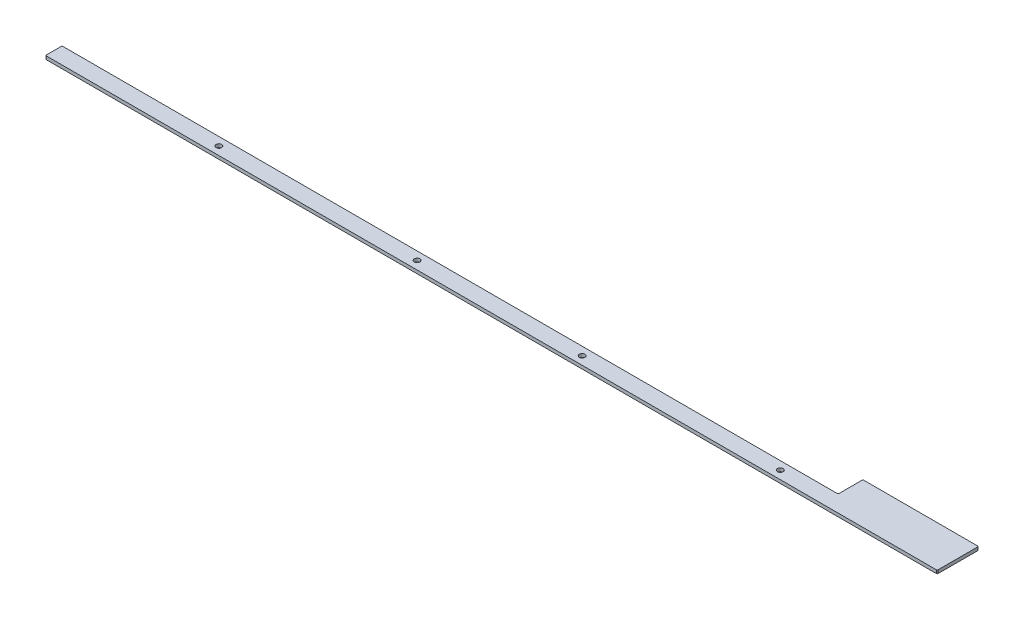
ISO-10303-21;
HEADER;
FILE_DESCRIPTION(('STEP AP214'),'2;1');
FILE_NAME('part.step','',(''),(''),'','','');
FILE_SCHEMA(('AUTOMOTIVE_DESIGN { 1 0 10303 214 1 1 1 1 }'));
ENDSEC;
DATA;
#1=APPLICATION_CONTEXT('core data for automotive mechanical design processes');
#2=APPLICATION_PROTOCOL_DEFINITION('international standard','automotive_design',2000,#1);
#3=PRODUCT_CONTEXT('',#1,'mechanical');
#4=PRODUCT('Part','Part','',(#3));
#5=PRODUCT_RELATED_PRODUCT_CATEGORY('part','',(#4));
#6=PRODUCT_DEFINITION_FORMATION('','',#4);
#7=PRODUCT_DEFINITION_CONTEXT('part definition',#1,'design');
#8=PRODUCT_DEFINITION('design','',#6,#7);
#9=PRODUCT_DEFINITION_SHAPE('','',#8);
#10=(LENGTH_UNIT() NAMED_UNIT(*) SI_UNIT(.MILLI.,.METRE.));
#11=(NAMED_UNIT(*) PLANE_ANGLE_UNIT() SI_UNIT($,.RADIAN.));
#12=(NAMED_UNIT(*) SI_UNIT($,.STERADIAN.) SOLID_ANGLE_UNIT());
#13=UNCERTAINTY_MEASURE_WITH_UNIT(LENGTH_MEASURE(1.E-05),#10,'distance_accuracy_value','');
#14=(GEOMETRIC_REPRESENTATION_CONTEXT(3) GLOBAL_UNCERTAINTY_ASSIGNED_CONTEXT((#13)) GLOBAL_UNIT_ASSIGNED_CONTEXT((#10,
#11,#12)) REPRESENTATION_CONTEXT('',''));
#15=CARTESIAN_POINT('',(0.,0.,0.));
#16=DIRECTION('',(0.,0.,1.));
#17=DIRECTION('',(1.,0.,0.));
#18=AXIS2_PLACEMENT_3D('',#15,#16,#17);
#19=CARTESIAN_POINT('',(-270.,2.,-5.00000000000003));
#20=DIRECTION('',(1.,0.,0.));
#21=DIRECTION('',(0.,0.,1.));
#22=AXIS2_PLACEMENT_3D('',#19,#20,#21);
#23=PLANE('',#22);
#24=DIRECTION('',(0.,0.,-1.));
#25=VECTOR('',#24,1.);
#26=CARTESIAN_POINT('',(-270.,0.,-5.00000000000003));
#27=LINE('',#26,#25);
#28=CARTESIAN_POINT('',(-270.,0.,4.49999999999997));
#29=VERTEX_POINT('',#28);
#30=CARTESIAN_POINT('',(-270.,0.,-4.50000000000004));
#31=VERTEX_POINT('',#30);
#32=EDGE_CURVE('E136',#29,#31,#27,.T.);
#33=ORIENTED_EDGE('',*,*,#32,.F.);
#34=DIRECTION('',(0.,-1.,0.));
#35=VECTOR('',#34,1.);
#36=CARTESIAN_POINT('',(-270.,2.,4.49999999999997));
#37=LINE('',#36,#35);
#38=CARTESIAN_POINT('',(-270.,2.,4.49999999999997));
#39=VERTEX_POINT('',#38);
#40=EDGE_CURVE('E140',#39,#29,#37,.T.);
#41=ORIENTED_EDGE('',*,*,#40,.F.);
#42=DIRECTION('',(0.,0.,-1.));
#43=VECTOR('',#42,1.);
#44=CARTESIAN_POINT('',(-270.,2.,-5.00000000000003));
#45=LINE('',#44,#43);
#46=CARTESIAN_POINT('',(-270.,2.,-4.50000000000004));
#47=VERTEX_POINT('',#46);
#48=EDGE_CURVE('E166',#39,#47,#45,.T.);
#49=ORIENTED_EDGE('',*,*,#48,.T.);
#50=DIRECTION('',(0.,-1.,0.));
#51=VECTOR('',#50,1.);
#52=CARTESIAN_POINT('',(-270.,2.,-4.50000000000004));
#53=LINE('',#52,#51);
#54=EDGE_CURVE('E188',#31,#47,#53,.F.);
#55=ORIENTED_EDGE('',*,*,#54,.F.);
#56=EDGE_LOOP('',(#33,#41,#49,#55));
#57=FACE_BOUND('',#56,.T.);
#58=ADVANCED_FACE('F38',(#57),#23,.F.);
#59=CARTESIAN_POINT('',(270.,2.,-4.99999999999997));
#60=DIRECTION('',(0.,0.,1.));
#61=DIRECTION('',(-1.,0.,0.));
#62=AXIS2_PLACEMENT_3D('',#59,#60,#61);
#63=PLANE('',#62);
#64=DIRECTION('',(1.,0.,0.));
#65=VECTOR('',#64,1.);
#66=CARTESIAN_POINT('',(270.,2.,-4.99999999999997));
#67=LINE('',#66,#65);
#68=CARTESIAN_POINT('',(-269.5,2.,-5.00000000000003));
#69=VERTEX_POINT('',#68);
#70=CARTESIAN_POINT('',(199.5,2.,-4.99999999999998));
#71=VERTEX_POINT('',#70);
#72=EDGE_CURVE('E214',#69,#71,#67,.T.);
#73=ORIENTED_EDGE('',*,*,#72,.T.);
#74=DIRECTION('',(0.,1.,0.));
#75=VECTOR('',#74,1.);
#76=CARTESIAN_POINT('',(199.5,2.,-4.99999999999998));
#77=LINE('',#76,#75);
#78=CARTESIAN_POINT('',(199.5,0.,-4.99999999999998));
#79=VERTEX_POINT('',#78);
#80=EDGE_CURVE('E151',#79,#71,#77,.T.);
#81=ORIENTED_EDGE('',*,*,#80,.F.);
#82=DIRECTION('',(1.,0.,0.));
#83=VECTOR('',#82,1.);
#84=CARTESIAN_POINT('',(270.,0.,-4.99999999999997));
#85=LINE('',#84,#83);
#86=CARTESIAN_POINT('',(-269.5,0.,-5.00000000000003));
#87=VERTEX_POINT('',#86);
#88=EDGE_CURVE('E133',#87,#79,#85,.T.);
#89=ORIENTED_EDGE('',*,*,#88,.F.);
#90=DIRECTION('',(0.,-1.,0.));
#91=VECTOR('',#90,1.);
#92=CARTESIAN_POINT('',(-269.5,2.,-5.00000000000003));
#93=LINE('',#92,#91);
#94=EDGE_CURVE('E144',#69,#87,#93,.T.);
#95=ORIENTED_EDGE('',*,*,#94,.F.);
#96=EDGE_LOOP('',(#73,#81,#89,#95));
#97=FACE_BOUND('',#96,.T.);
#98=ADVANCED_FACE('F153',(#97),#63,.F.);
#99=CARTESIAN_POINT('',(270.,2.,-4.99999999999997));
#100=DIRECTION('',(-1.,0.,0.));
#101=DIRECTION('',(0.,0.,-1.));
#102=AXIS2_PLACEMENT_3D('',#99,#100,#101);
#103=PLANE('',#102);
#104=DIRECTION('',(0.,0.,1.));
#105=VECTOR('',#104,1.);
#106=CARTESIAN_POINT('',(270.,2.,-4.99999999999997));
#107=LINE('',#106,#105);
#108=CARTESIAN_POINT('',(270.,2.,-19.5));
#109=VERTEX_POINT('',#108);
#110=CARTESIAN_POINT('',(270.,2.,4.50000000000003));
#111=VERTEX_POINT('',#110);
#112=EDGE_CURVE('E344',#109,#111,#107,.T.);
#113=ORIENTED_EDGE('',*,*,#112,.T.);
#114=DIRECTION('',(0.,-1.,0.));
#115=VECTOR('',#114,1.);
#116=CARTESIAN_POINT('',(270.,2.,4.50000000000003));
#117=LINE('',#116,#115);
#118=CARTESIAN_POINT('',(270.,0.,4.50000000000003));
#119=VERTEX_POINT('',#118);
#120=EDGE_CURVE('E235',#119,#111,#117,.F.);
#121=ORIENTED_EDGE('',*,*,#120,.F.);
#122=DIRECTION('',(0.,0.,1.));
#123=VECTOR('',#122,1.);
#124=CARTESIAN_POINT('',(270.,0.,-4.99999999999997));
#125=LINE('',#124,#123);
#126=CARTESIAN_POINT('',(270.,0.,-19.5));
#127=VERTEX_POINT('',#126);
#128=EDGE_CURVE('E155',#127,#119,#125,.T.);
#129=ORIENTED_EDGE('',*,*,#128,.F.);
#130=DIRECTION('',(0.,1.,0.));
#131=VECTOR('',#130,1.);
#132=CARTESIAN_POINT('',(270.,0.,-19.5));
#133=LINE('',#132,#131);
#134=EDGE_CURVE('E237',#109,#127,#133,.F.);
#135=ORIENTED_EDGE('',*,*,#134,.F.);
#136=EDGE_LOOP('',(#113,#121,#129,#135));
#137=FACE_BOUND('',#136,.T.);
#138=ADVANCED_FACE('F320',(#137),#103,.F.);
#139=CARTESIAN_POINT('',(270.,2.,5.00000000000003));
#140=DIRECTION('',(0.,0.,-1.));
#141=DIRECTION('',(1.,0.,0.));
#142=AXIS2_PLACEMENT_3D('',#139,#140,#141);
#143=PLANE('',#142);
#144=DIRECTION('',(-1.,0.,0.));
#145=VECTOR('',#144,1.);
#146=CARTESIAN_POINT('',(270.,2.,5.00000000000003));
#147=LINE('',#146,#145);
#148=CARTESIAN_POINT('',(269.5,2.,5.00000000000003));
#149=VERTEX_POINT('',#148);
#150=CARTESIAN_POINT('',(-269.5,2.,4.99999999999997));
#151=VERTEX_POINT('',#150);
#152=EDGE_CURVE('E176',#149,#151,#147,.T.);
#153=ORIENTED_EDGE('',*,*,#152,.T.);
#154=DIRECTION('',(0.,-1.,0.));
#155=VECTOR('',#154,1.);
#156=CARTESIAN_POINT('',(-269.5,2.,4.99999999999997));
#157=LINE('',#156,#155);
#158=CARTESIAN_POINT('',(-269.5,0.,4.99999999999997));
#159=VERTEX_POINT('',#158);
#160=EDGE_CURVE('E240',#159,#151,#157,.F.);
#161=ORIENTED_EDGE('',*,*,#160,.F.);
#162=DIRECTION('',(-1.,0.,0.));
#163=VECTOR('',#162,1.);
#164=CARTESIAN_POINT('',(270.,0.,5.00000000000003));
#165=LINE('',#164,#163);
#166=CARTESIAN_POINT('',(269.5,0.,5.00000000000003));
#167=VERTEX_POINT('',#166);
#168=EDGE_CURVE('E158',#167,#159,#165,.T.);
#169=ORIENTED_EDGE('',*,*,#168,.F.);
#170=DIRECTION('',(0.,-1.,0.));
#171=VECTOR('',#170,1.);
#172=CARTESIAN_POINT('',(269.5,2.,5.00000000000003));
#173=LINE('',#172,#171);
#174=EDGE_CURVE('E242',#149,#167,#173,.T.);
#175=ORIENTED_EDGE('',*,*,#174,.F.);
#176=EDGE_LOOP('',(#153,#161,#169,#175));
#177=FACE_BOUND('',#176,.T.);
#178=ADVANCED_FACE('F364',(#177),#143,.F.);
#179=CARTESIAN_POINT('',(0.,2.,0.));
#180=DIRECTION('',(0.,1.,0.));
#181=DIRECTION('',(0.,0.,-1.));
#182=AXIS2_PLACEMENT_3D('',#179,#180,#181);
#183=PLANE('',#182);
#184=CARTESIAN_POINT('',(-170.,2.,0.));
#185=DIRECTION('',(0.,-1.,0.));
#186=DIRECTION('',(0.,0.,-1.));
#187=AXIS2_PLACEMENT_3D('',#184,#185,#186);
#188=CIRCLE('',#187,1.70000000000001);
#189=CARTESIAN_POINT('',(-170.,2.,-1.70000000000001));
#190=VERTEX_POINT('',#189);
#191=EDGE_CURVE('E275',#190,#190,#188,.T.);
#192=ORIENTED_EDGE('',*,*,#191,.T.);
#193=EDGE_LOOP('',(#192));
#194=FACE_BOUND('',#193,.T.);
#195=CARTESIAN_POINT('',(-50.,2.,0.));
#196=DIRECTION('',(0.,-1.,0.));
#197=DIRECTION('',(0.,0.,-1.));
#198=AXIS2_PLACEMENT_3D('',#195,#196,#197);
#199=CIRCLE('',#198,1.7);
#200=CARTESIAN_POINT('',(-50.,2.,-1.7));
#201=VERTEX_POINT('',#200);
#202=EDGE_CURVE('E269',#201,#201,#199,.T.);
#203=ORIENTED_EDGE('',*,*,#202,.T.);
#204=EDGE_LOOP('',(#203));
#205=FACE_BOUND('',#204,.T.);
#206=CARTESIAN_POINT('',(50.,2.,0.));
#207=DIRECTION('',(0.,-1.,0.));
#208=DIRECTION('',(0.,0.,-1.));
#209=AXIS2_PLACEMENT_3D('',#206,#207,#208);
#210=CIRCLE('',#209,1.7);
#211=CARTESIAN_POINT('',(50.,2.,-1.7));
#212=VERTEX_POINT('',#211);
#213=EDGE_CURVE('E175',#212,#212,#210,.T.);
#214=ORIENTED_EDGE('',*,*,#213,.T.);
#215=EDGE_LOOP('',(#214));
#216=FACE_BOUND('',#215,.T.);
#217=CARTESIAN_POINT('',(170.,2.,0.));
#218=DIRECTION('',(0.,-1.,0.));
#219=DIRECTION('',(0.,0.,-1.));
#220=AXIS2_PLACEMENT_3D('',#217,#218,#219);
#221=CIRCLE('',#220,1.70000000000001);
#222=CARTESIAN_POINT('',(170.,2.,-1.70000000000001));
#223=VERTEX_POINT('',#222);
#224=EDGE_CURVE('E171',#223,#223,#221,.T.);
#225=ORIENTED_EDGE('',*,*,#224,.T.);
#226=EDGE_LOOP('',(#225));
#227=FACE_BOUND('',#226,.T.);
#228=ORIENTED_EDGE('',*,*,#48,.F.);
#229=CARTESIAN_POINT('',(-269.5,2.,4.49999999999997));
#230=DIRECTION('',(0.,-1.,0.));
#231=DIRECTION('',(0.,0.,-1.));
#232=AXIS2_PLACEMENT_3D('',#229,#230,#231);
#233=CIRCLE('',#232,0.5);
#234=EDGE_CURVE('E53',#151,#39,#233,.T.);
#235=ORIENTED_EDGE('',*,*,#234,.F.);
#236=ORIENTED_EDGE('',*,*,#152,.F.);
#237=CARTESIAN_POINT('',(269.5,2.,4.50000000000003));
#238=DIRECTION('',(0.,-1.,0.));
#239=DIRECTION('',(0.,0.,-1.));
#240=AXIS2_PLACEMENT_3D('',#237,#238,#239);
#241=CIRCLE('',#240,0.5);
#242=EDGE_CURVE('E61',#111,#149,#241,.T.);
#243=ORIENTED_EDGE('',*,*,#242,.F.);
#244=ORIENTED_EDGE('',*,*,#112,.F.);
#245=CARTESIAN_POINT('',(269.5,2.,-19.5));
#246=DIRECTION('',(0.,-1.,0.));
#247=DIRECTION('',(0.,0.,-1.));
#248=AXIS2_PLACEMENT_3D('',#245,#246,#247);
#249=CIRCLE('',#248,0.5);
#250=CARTESIAN_POINT('',(269.5,2.,-20.));
#251=VERTEX_POINT('',#250);
#252=EDGE_CURVE('E226',#251,#109,#249,.T.);
#253=ORIENTED_EDGE('',*,*,#252,.F.);
#254=DIRECTION('',(1.,0.,0.));
#255=VECTOR('',#254,1.);
#256=CARTESIAN_POINT('',(270.,2.,-20.));
#257=LINE('',#256,#255);
#258=CARTESIAN_POINT('',(200.5,2.,-20.));
#259=VERTEX_POINT('',#258);
#260=EDGE_CURVE('E204',#259,#251,#257,.T.);
#261=ORIENTED_EDGE('',*,*,#260,.F.);
#262=CARTESIAN_POINT('',(200.5,2.,-19.5));
#263=DIRECTION('',(0.,-1.,0.));
#264=DIRECTION('',(0.,0.,-1.));
#265=AXIS2_PLACEMENT_3D('',#262,#263,#264);
#266=CIRCLE('',#265,0.5);
#267=CARTESIAN_POINT('',(200.,2.,-19.5));
#268=VERTEX_POINT('',#267);
#269=EDGE_CURVE('E190',#268,#259,#266,.T.);
#270=ORIENTED_EDGE('',*,*,#269,.F.);
#271=DIRECTION('',(0.,0.,-1.));
#272=VECTOR('',#271,1.);
#273=CARTESIAN_POINT('',(200.,2.,-4.99999999999998));
#274=LINE('',#273,#272);
#275=CARTESIAN_POINT('',(200.,2.,-5.49999999999998));
#276=VERTEX_POINT('',#275);
#277=EDGE_CURVE('E170',#276,#268,#274,.T.);
#278=ORIENTED_EDGE('',*,*,#277,.F.);
#279=CARTESIAN_POINT('',(199.5,2.,-5.49999999999998));
#280=DIRECTION('',(0.,-1.,0.));
#281=DIRECTION('',(0.,0.,-1.));
#282=AXIS2_PLACEMENT_3D('',#279,#280,#281);
#283=CIRCLE('',#282,0.5);
#284=EDGE_CURVE('E46',#71,#276,#283,.F.);
#285=ORIENTED_EDGE('',*,*,#284,.F.);
#286=ORIENTED_EDGE('',*,*,#72,.F.);
#287=CARTESIAN_POINT('',(-269.5,2.,-4.50000000000004));
#288=DIRECTION('',(0.,-1.,0.));
#289=DIRECTION('',(0.,0.,-1.));
#290=AXIS2_PLACEMENT_3D('',#287,#288,#289);
#291=CIRCLE('',#290,0.5);
#292=EDGE_CURVE('E146',#47,#69,#291,.T.);
#293=ORIENTED_EDGE('',*,*,#292,.F.);
#294=EDGE_LOOP('',(#228,#235,#236,#243,#244,#253,#261,#270,#278,#285,#286,#293));
#295=FACE_BOUND('',#294,.T.);
#296=ADVANCED_FACE('F250',(#194,#205,#216,#227,#295),#183,.T.);
#297=CARTESIAN_POINT('',(0.,0.,0.));
#298=DIRECTION('',(0.,1.,0.));
#299=DIRECTION('',(0.,0.,-1.));
#300=AXIS2_PLACEMENT_3D('',#297,#298,#299);
#301=PLANE('',#300);
#302=CARTESIAN_POINT('',(-170.,0.,0.));
#303=DIRECTION('',(0.,-1.,0.));
#304=DIRECTION('',(0.,0.,-1.));
#305=AXIS2_PLACEMENT_3D('',#302,#303,#304);
#306=CIRCLE('',#305,1.70000000000001);
#307=CARTESIAN_POINT('',(-170.,0.,-1.70000000000001));
#308=VERTEX_POINT('',#307);
#309=EDGE_CURVE('E273',#308,#308,#306,.T.);
#310=ORIENTED_EDGE('',*,*,#309,.F.);
#311=EDGE_LOOP('',(#310));
#312=FACE_BOUND('',#311,.T.);
#313=CARTESIAN_POINT('',(-50.,0.,0.));
#314=DIRECTION('',(0.,-1.,0.));
#315=DIRECTION('',(0.,0.,-1.));
#316=AXIS2_PLACEMENT_3D('',#313,#314,#315);
#317=CIRCLE('',#316,1.7);
#318=CARTESIAN_POINT('',(-50.,0.,-1.7));
#319=VERTEX_POINT('',#318);
#320=EDGE_CURVE('E264',#319,#319,#317,.T.);
#321=ORIENTED_EDGE('',*,*,#320,.F.);
#322=EDGE_LOOP('',(#321));
#323=FACE_BOUND('',#322,.T.);
#324=CARTESIAN_POINT('',(50.,0.,0.));
#325=DIRECTION('',(0.,-1.,0.));
#326=DIRECTION('',(0.,0.,-1.));
#327=AXIS2_PLACEMENT_3D('',#324,#325,#326);
#328=CIRCLE('',#327,1.7);
#329=CARTESIAN_POINT('',(50.,0.,-1.7));
#330=VERTEX_POINT('',#329);
#331=EDGE_CURVE('E172',#330,#330,#328,.T.);
#332=ORIENTED_EDGE('',*,*,#331,.F.);
#333=EDGE_LOOP('',(#332));
#334=FACE_BOUND('',#333,.T.);
#335=CARTESIAN_POINT('',(170.,0.,0.));
#336=DIRECTION('',(0.,-1.,0.));
#337=DIRECTION('',(0.,0.,-1.));
#338=AXIS2_PLACEMENT_3D('',#335,#336,#337);
#339=CIRCLE('',#338,1.70000000000001);
#340=CARTESIAN_POINT('',(170.,0.,-1.70000000000001));
#341=VERTEX_POINT('',#340);
#342=EDGE_CURVE('E167',#341,#341,#339,.T.);
#343=ORIENTED_EDGE('',*,*,#342,.F.);
#344=EDGE_LOOP('',(#343));
#345=FACE_BOUND('',#344,.T.);
#346=ORIENTED_EDGE('',*,*,#88,.T.);
#347=CARTESIAN_POINT('',(199.5,0.,-5.49999999999998));
#348=DIRECTION('',(0.,-1.,0.));
#349=DIRECTION('',(0.,0.,-1.));
#350=AXIS2_PLACEMENT_3D('',#347,#348,#349);
#351=CIRCLE('',#350,0.5);
#352=CARTESIAN_POINT('',(200.,0.,-5.49999999999998));
#353=VERTEX_POINT('',#352);
#354=EDGE_CURVE('E12',#353,#79,#351,.T.);
#355=ORIENTED_EDGE('',*,*,#354,.F.);
#356=DIRECTION('',(0.,0.,-1.));
#357=VECTOR('',#356,1.);
#358=CARTESIAN_POINT('',(200.,0.,-4.99999999999998));
#359=LINE('',#358,#357);
#360=CARTESIAN_POINT('',(200.,0.,-19.5));
#361=VERTEX_POINT('',#360);
#362=EDGE_CURVE('E208',#353,#361,#359,.T.);
#363=ORIENTED_EDGE('',*,*,#362,.T.);
#364=CARTESIAN_POINT('',(200.5,0.,-19.5));
#365=DIRECTION('',(0.,-1.,0.));
#366=DIRECTION('',(0.,0.,-1.));
#367=AXIS2_PLACEMENT_3D('',#364,#365,#366);
#368=CIRCLE('',#367,0.5);
#369=CARTESIAN_POINT('',(200.5,0.,-20.));
#370=VERTEX_POINT('',#369);
#371=EDGE_CURVE('E150',#370,#361,#368,.F.);
#372=ORIENTED_EDGE('',*,*,#371,.F.);
#373=DIRECTION('',(1.,0.,0.));
#374=VECTOR('',#373,1.);
#375=CARTESIAN_POINT('',(270.,0.,-20.));
#376=LINE('',#375,#374);
#377=CARTESIAN_POINT('',(269.5,0.,-20.));
#378=VERTEX_POINT('',#377);
#379=EDGE_CURVE('E160',#370,#378,#376,.T.);
#380=ORIENTED_EDGE('',*,*,#379,.T.);
#381=CARTESIAN_POINT('',(269.5,0.,-19.5));
#382=DIRECTION('',(0.,-1.,0.));
#383=DIRECTION('',(0.,0.,-1.));
#384=AXIS2_PLACEMENT_3D('',#381,#382,#383);
#385=CIRCLE('',#384,0.5);
#386=EDGE_CURVE('E141',#127,#378,#385,.F.);
#387=ORIENTED_EDGE('',*,*,#386,.F.);
#388=ORIENTED_EDGE('',*,*,#128,.T.);
#389=CARTESIAN_POINT('',(269.5,0.,4.50000000000003));
#390=DIRECTION('',(0.,-1.,0.));
#391=DIRECTION('',(0.,0.,-1.));
#392=AXIS2_PLACEMENT_3D('',#389,#390,#391);
#393=CIRCLE('',#392,0.5);
#394=EDGE_CURVE('E182',#167,#119,#393,.F.);
#395=ORIENTED_EDGE('',*,*,#394,.F.);
#396=ORIENTED_EDGE('',*,*,#168,.T.);
#397=CARTESIAN_POINT('',(-269.5,0.,4.49999999999997));
#398=DIRECTION('',(0.,-1.,0.));
#399=DIRECTION('',(0.,0.,-1.));
#400=AXIS2_PLACEMENT_3D('',#397,#398,#399);
#401=CIRCLE('',#400,0.5);
#402=EDGE_CURVE('E180',#29,#159,#401,.F.);
#403=ORIENTED_EDGE('',*,*,#402,.F.);
#404=ORIENTED_EDGE('',*,*,#32,.T.);
#405=CARTESIAN_POINT('',(-269.5,0.,-4.50000000000004));
#406=DIRECTION('',(0.,-1.,0.));
#407=DIRECTION('',(0.,0.,-1.));
#408=AXIS2_PLACEMENT_3D('',#405,#406,#407);
#409=CIRCLE('',#408,0.5);
#410=EDGE_CURVE('E128',#87,#31,#409,.F.);
#411=ORIENTED_EDGE('',*,*,#410,.F.);
#412=EDGE_LOOP('',(#346,#355,#363,#372,#380,#387,#388,#395,#396,#403,#404,#411));
#413=FACE_BOUND('',#412,.T.);
#414=ADVANCED_FACE('F130',(#312,#323,#334,#345,#413),#301,.F.);
#415=CARTESIAN_POINT('',(270.,0.,-20.));
#416=DIRECTION('',(0.,0.,-1.));
#417=DIRECTION('',(1.,0.,0.));
#418=AXIS2_PLACEMENT_3D('',#415,#416,#417);
#419=PLANE('',#418);
#420=ORIENTED_EDGE('',*,*,#379,.F.);
#421=DIRECTION('',(0.,1.,0.));
#422=VECTOR('',#421,1.);
#423=CARTESIAN_POINT('',(200.5,0.,-20.));
#424=LINE('',#423,#422);
#425=EDGE_CURVE('E231',#259,#370,#424,.F.);
#426=ORIENTED_EDGE('',*,*,#425,.F.);
#427=ORIENTED_EDGE('',*,*,#260,.T.);
#428=DIRECTION('',(0.,1.,0.));
#429=VECTOR('',#428,1.);
#430=CARTESIAN_POINT('',(269.5,2.,-20.));
#431=LINE('',#430,#429);
#432=EDGE_CURVE('E233',#378,#251,#431,.T.);
#433=ORIENTED_EDGE('',*,*,#432,.F.);
#434=EDGE_LOOP('',(#420,#426,#427,#433));
#435=FACE_BOUND('',#434,.T.);
#436=ADVANCED_FACE('F291',(#435),#419,.T.);
#437=CARTESIAN_POINT('',(200.,0.,-4.99999999999998));
#438=DIRECTION('',(-1.,0.,0.));
#439=DIRECTION('',(0.,0.,-1.));
#440=AXIS2_PLACEMENT_3D('',#437,#438,#439);
#441=PLANE('',#440);
#442=ORIENTED_EDGE('',*,*,#277,.T.);
#443=DIRECTION('',(0.,1.,0.));
#444=VECTOR('',#443,1.);
#445=CARTESIAN_POINT('',(200.,0.,-19.5));
#446=LINE('',#445,#444);
#447=EDGE_CURVE('E225',#361,#268,#446,.T.);
#448=ORIENTED_EDGE('',*,*,#447,.F.);
#449=ORIENTED_EDGE('',*,*,#362,.F.);
#450=DIRECTION('',(0.,1.,0.));
#451=VECTOR('',#450,1.);
#452=CARTESIAN_POINT('',(200.,0.,-5.49999999999998));
#453=LINE('',#452,#451);
#454=EDGE_CURVE('E229',#276,#353,#453,.F.);
#455=ORIENTED_EDGE('',*,*,#454,.F.);
#456=EDGE_LOOP('',(#442,#448,#449,#455));
#457=FACE_BOUND('',#456,.T.);
#458=ADVANCED_FACE('F253',(#457),#441,.T.);
#459=CARTESIAN_POINT('',(170.,2.,0.));
#460=DIRECTION('',(0.,1.,0.));
#461=DIRECTION('',(0.,0.,-1.));
#462=AXIS2_PLACEMENT_3D('',#459,#460,#461);
#463=CYLINDRICAL_SURFACE('',#462,1.70000000000001);
#464=ORIENTED_EDGE('',*,*,#224,.F.);
#465=EDGE_LOOP('',(#464));
#466=FACE_BOUND('',#465,.T.);
#467=ORIENTED_EDGE('',*,*,#342,.T.);
#468=EDGE_LOOP('',(#467));
#469=FACE_BOUND('',#468,.T.);
#470=ADVANCED_FACE('F300',(#466,#469),#463,.F.);
#471=CARTESIAN_POINT('',(50.,2.,0.));
#472=DIRECTION('',(0.,1.,0.));
#473=DIRECTION('',(0.,0.,-1.));
#474=AXIS2_PLACEMENT_3D('',#471,#472,#473);
#475=CYLINDRICAL_SURFACE('',#474,1.7);
#476=ORIENTED_EDGE('',*,*,#213,.F.);
#477=EDGE_LOOP('',(#476));
#478=FACE_BOUND('',#477,.T.);
#479=ORIENTED_EDGE('',*,*,#331,.T.);
#480=EDGE_LOOP('',(#479));
#481=FACE_BOUND('',#480,.T.);
#482=ADVANCED_FACE('F302',(#478,#481),#475,.F.);
#483=CARTESIAN_POINT('',(-50.,2.,0.));
#484=DIRECTION('',(0.,1.,0.));
#485=DIRECTION('',(0.,0.,-1.));
#486=AXIS2_PLACEMENT_3D('',#483,#484,#485);
#487=CYLINDRICAL_SURFACE('',#486,1.7);
#488=ORIENTED_EDGE('',*,*,#202,.F.);
#489=EDGE_LOOP('',(#488));
#490=FACE_BOUND('',#489,.T.);
#491=ORIENTED_EDGE('',*,*,#320,.T.);
#492=EDGE_LOOP('',(#491));
#493=FACE_BOUND('',#492,.T.);
#494=ADVANCED_FACE('F285',(#490,#493),#487,.F.);
#495=CARTESIAN_POINT('',(-170.,2.,0.));
#496=DIRECTION('',(0.,1.,0.));
#497=DIRECTION('',(0.,0.,-1.));
#498=AXIS2_PLACEMENT_3D('',#495,#496,#497);
#499=CYLINDRICAL_SURFACE('',#498,1.70000000000001);
#500=ORIENTED_EDGE('',*,*,#191,.F.);
#501=EDGE_LOOP('',(#500));
#502=FACE_BOUND('',#501,.T.);
#503=ORIENTED_EDGE('',*,*,#309,.T.);
#504=EDGE_LOOP('',(#503));
#505=FACE_BOUND('',#504,.T.);
#506=ADVANCED_FACE('F282',(#502,#505),#499,.F.);
#507=CARTESIAN_POINT('',(-269.5,2.,-4.50000000000004));
#508=DIRECTION('',(0.,-1.,0.));
#509=DIRECTION('',(0.,0.,1.));
#510=AXIS2_PLACEMENT_3D('',#507,#508,#509);
#511=CYLINDRICAL_SURFACE('',#510,0.5);
#512=ORIENTED_EDGE('',*,*,#292,.T.);
#513=ORIENTED_EDGE('',*,*,#94,.T.);
#514=ORIENTED_EDGE('',*,*,#410,.T.);
#515=ORIENTED_EDGE('',*,*,#54,.T.);
#516=EDGE_LOOP('',(#512,#513,#514,#515));
#517=FACE_BOUND('',#516,.T.);
#518=ADVANCED_FACE('F145',(#517),#511,.T.);
#519=CARTESIAN_POINT('',(199.5,2.,-5.49999999999998));
#520=DIRECTION('',(0.,1.,0.));
#521=DIRECTION('',(0.,0.,-1.));
#522=AXIS2_PLACEMENT_3D('',#519,#520,#521);
#523=CYLINDRICAL_SURFACE('',#522,0.5);
#524=ORIENTED_EDGE('',*,*,#354,.T.);
#525=ORIENTED_EDGE('',*,*,#80,.T.);
#526=ORIENTED_EDGE('',*,*,#284,.T.);
#527=ORIENTED_EDGE('',*,*,#454,.T.);
#528=EDGE_LOOP('',(#524,#525,#526,#527));
#529=FACE_BOUND('',#528,.T.);
#530=ADVANCED_FACE('F246',(#529),#523,.F.);
#531=CARTESIAN_POINT('',(269.5,0.,-19.5));
#532=DIRECTION('',(0.,-1.,0.));
#533=DIRECTION('',(0.,0.,1.));
#534=AXIS2_PLACEMENT_3D('',#531,#532,#533);
#535=CYLINDRICAL_SURFACE('',#534,0.5);
#536=ORIENTED_EDGE('',*,*,#386,.T.);
#537=ORIENTED_EDGE('',*,*,#432,.T.);
#538=ORIENTED_EDGE('',*,*,#252,.T.);
#539=ORIENTED_EDGE('',*,*,#134,.T.);
#540=EDGE_LOOP('',(#536,#537,#538,#539));
#541=FACE_BOUND('',#540,.T.);
#542=ADVANCED_FACE('F328',(#541),#535,.T.);
#543=CARTESIAN_POINT('',(269.5,2.,4.50000000000003));
#544=DIRECTION('',(0.,-1.,0.));
#545=DIRECTION('',(0.,0.,1.));
#546=AXIS2_PLACEMENT_3D('',#543,#544,#545);
#547=CYLINDRICAL_SURFACE('',#546,0.5);
#548=ORIENTED_EDGE('',*,*,#242,.T.);
#549=ORIENTED_EDGE('',*,*,#174,.T.);
#550=ORIENTED_EDGE('',*,*,#394,.T.);
#551=ORIENTED_EDGE('',*,*,#120,.T.);
#552=EDGE_LOOP('',(#548,#549,#550,#551));
#553=FACE_BOUND('',#552,.T.);
#554=ADVANCED_FACE('F331',(#553),#547,.T.);
#555=CARTESIAN_POINT('',(-269.5,2.,4.49999999999997));
#556=DIRECTION('',(0.,-1.,0.));
#557=DIRECTION('',(0.,0.,1.));
#558=AXIS2_PLACEMENT_3D('',#555,#556,#557);
#559=CYLINDRICAL_SURFACE('',#558,0.5);
#560=ORIENTED_EDGE('',*,*,#234,.T.);
#561=ORIENTED_EDGE('',*,*,#40,.T.);
#562=ORIENTED_EDGE('',*,*,#402,.T.);
#563=ORIENTED_EDGE('',*,*,#160,.T.);
#564=EDGE_LOOP('',(#560,#561,#562,#563));
#565=FACE_BOUND('',#564,.T.);
#566=ADVANCED_FACE('F334',(#565),#559,.T.);
#567=CARTESIAN_POINT('',(200.5,0.,-19.5));
#568=DIRECTION('',(0.,1.,0.));
#569=DIRECTION('',(0.,0.,-1.));
#570=AXIS2_PLACEMENT_3D('',#567,#568,#569);
#571=CYLINDRICAL_SURFACE('',#570,0.5);
#572=ORIENTED_EDGE('',*,*,#371,.T.);
#573=ORIENTED_EDGE('',*,*,#447,.T.);
#574=ORIENTED_EDGE('',*,*,#269,.T.);
#575=ORIENTED_EDGE('',*,*,#425,.T.);
#576=EDGE_LOOP('',(#572,#573,#574,#575));
#577=FACE_BOUND('',#576,.T.);
#578=ADVANCED_FACE('F40',(#577),#571,.T.);
#579=CLOSED_SHELL('',(#58,#98,#138,#178,#296,#414,#436,#458,#470,#482,#494,#506,#518,#530,#542,
#554,#566,#578));
#580=MANIFOLD_SOLID_BREP('B2',#579);
#581=ADVANCED_BREP_SHAPE_REPRESENTATION('',(#18,#580),#14);
#582=SHAPE_DEFINITION_REPRESENTATION(#9,#581);
ENDSEC;
END-ISO-10303-21;
